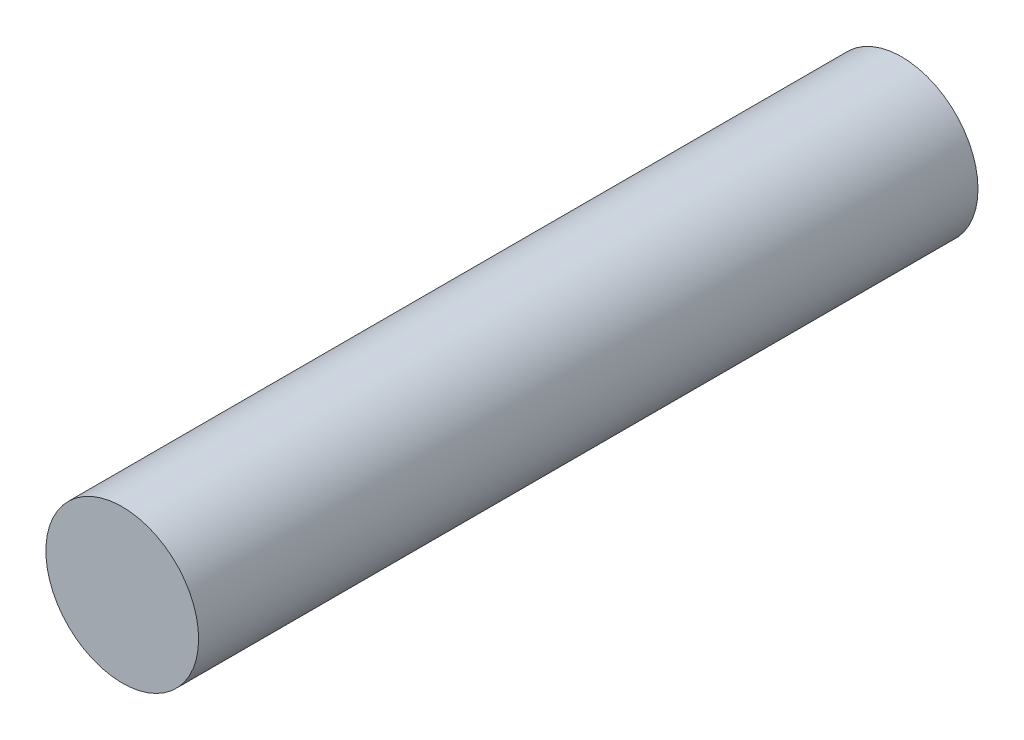
ISO-10303-21;
HEADER;
FILE_DESCRIPTION(('STEP AP214'),'2;1');
FILE_NAME('part.step','',(''),(''),'','','');
FILE_SCHEMA(('AUTOMOTIVE_DESIGN { 1 0 10303 214 1 1 1 1 }'));
ENDSEC;
DATA;
#1=APPLICATION_CONTEXT('core data for automotive mechanical design processes');
#2=APPLICATION_PROTOCOL_DEFINITION('international standard','automotive_design',2000,#1);
#3=PRODUCT_CONTEXT('',#1,'mechanical');
#4=PRODUCT('Part','Part','',(#3));
#5=PRODUCT_RELATED_PRODUCT_CATEGORY('part','',(#4));
#6=PRODUCT_DEFINITION_FORMATION('','',#4);
#7=PRODUCT_DEFINITION_CONTEXT('part definition',#1,'design');
#8=PRODUCT_DEFINITION('design','',#6,#7);
#9=PRODUCT_DEFINITION_SHAPE('','',#8);
#10=(LENGTH_UNIT() NAMED_UNIT(*) SI_UNIT(.MILLI.,.METRE.));
#11=(NAMED_UNIT(*) PLANE_ANGLE_UNIT() SI_UNIT($,.RADIAN.));
#12=(NAMED_UNIT(*) SI_UNIT($,.STERADIAN.) SOLID_ANGLE_UNIT());
#13=UNCERTAINTY_MEASURE_WITH_UNIT(LENGTH_MEASURE(1.E-05),#10,'distance_accuracy_value','');
#14=(GEOMETRIC_REPRESENTATION_CONTEXT(3) GLOBAL_UNCERTAINTY_ASSIGNED_CONTEXT((#13)) GLOBAL_UNIT_ASSIGNED_CONTEXT((#10,
#11,#12)) REPRESENTATION_CONTEXT('',''));
#15=CARTESIAN_POINT('',(0.,0.,0.));
#16=DIRECTION('',(0.,0.,1.));
#17=DIRECTION('',(1.,0.,0.));
#18=AXIS2_PLACEMENT_3D('',#15,#16,#17);
#19=CARTESIAN_POINT('',(0.,0.,1020.));
#20=DIRECTION('',(0.,0.,-1.));
#21=DIRECTION('',(-1.,0.,0.));
#22=AXIS2_PLACEMENT_3D('',#19,#20,#21);
#23=CYLINDRICAL_SURFACE('',#22,99.965);
#24=CARTESIAN_POINT('',(0.,0.,1020.));
#25=DIRECTION('',(0.,0.,1.));
#26=DIRECTION('',(1.,0.,0.));
#27=AXIS2_PLACEMENT_3D('',#24,#25,#26);
#28=CIRCLE('',#27,99.965);
#29=CARTESIAN_POINT('',(99.965,0.,1020.));
#30=VERTEX_POINT('',#29);
#31=EDGE_CURVE('E10',#30,#30,#28,.T.);
#32=ORIENTED_EDGE('',*,*,#31,.F.);
#33=EDGE_LOOP('',(#32));
#34=FACE_BOUND('',#33,.T.);
#35=CARTESIAN_POINT('',(0.,0.,0.));
#36=DIRECTION('',(0.,0.,1.));
#37=DIRECTION('',(1.,0.,0.));
#38=AXIS2_PLACEMENT_3D('',#35,#36,#37);
#39=CIRCLE('',#38,99.965);
#40=CARTESIAN_POINT('',(99.965,0.,0.));
#41=VERTEX_POINT('',#40);
#42=EDGE_CURVE('E36',#41,#41,#39,.T.);
#43=ORIENTED_EDGE('',*,*,#42,.T.);
#44=EDGE_LOOP('',(#43));
#45=FACE_BOUND('',#44,.T.);
#46=ADVANCED_FACE('F33',(#34,#45),#23,.T.);
#47=CARTESIAN_POINT('',(0.,0.,1020.));
#48=DIRECTION('',(0.,0.,1.));
#49=DIRECTION('',(1.,0.,0.));
#50=AXIS2_PLACEMENT_3D('',#47,#48,#49);
#51=PLANE('',#50);
#52=ORIENTED_EDGE('',*,*,#31,.T.);
#53=EDGE_LOOP('',(#52));
#54=FACE_BOUND('',#53,.T.);
#55=ADVANCED_FACE('F48',(#54),#51,.T.);
#56=CARTESIAN_POINT('',(0.,0.,0.));
#57=DIRECTION('',(0.,0.,1.));
#58=DIRECTION('',(1.,0.,0.));
#59=AXIS2_PLACEMENT_3D('',#56,#57,#58);
#60=PLANE('',#59);
#61=ORIENTED_EDGE('',*,*,#42,.F.);
#62=EDGE_LOOP('',(#61));
#63=FACE_BOUND('',#62,.T.);
#64=ADVANCED_FACE('F46',(#63),#60,.F.);
#65=CLOSED_SHELL('',(#46,#55,#64));
#66=MANIFOLD_SOLID_BREP('B2',#65);
#67=ADVANCED_BREP_SHAPE_REPRESENTATION('',(#18,#66),#14);
#68=SHAPE_DEFINITION_REPRESENTATION(#9,#67);
ENDSEC;
END-ISO-10303-21;
